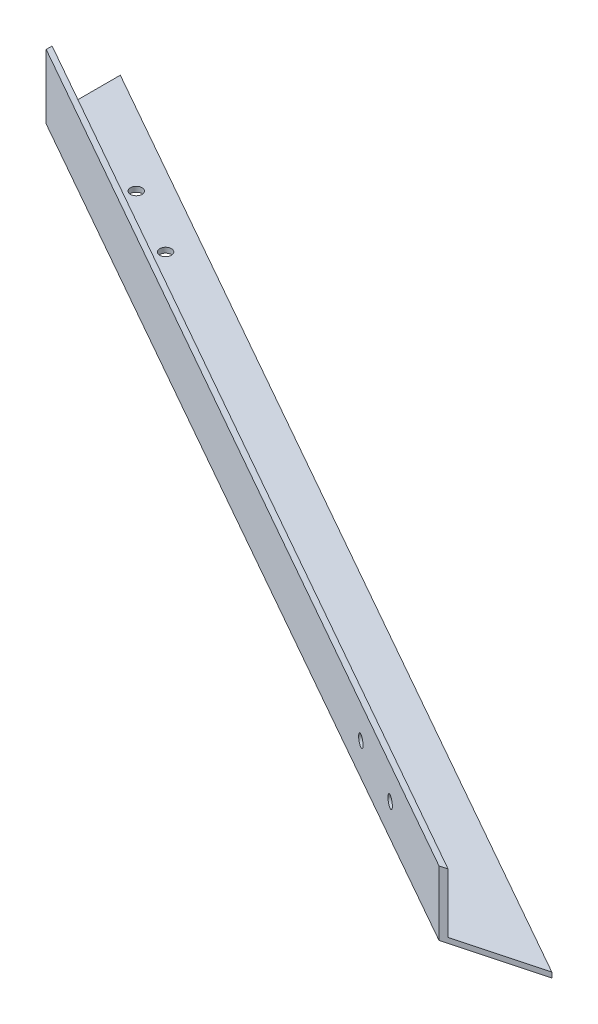
ISO-10303-21;
HEADER;
FILE_DESCRIPTION(('STEP AP214'),'2;1');
FILE_NAME('part.step','',(''),(''),'','','');
FILE_SCHEMA(('AUTOMOTIVE_DESIGN { 1 0 10303 214 1 1 1 1 }'));
ENDSEC;
DATA;
#1=APPLICATION_CONTEXT('core data for automotive mechanical design processes');
#2=APPLICATION_PROTOCOL_DEFINITION('international standard','automotive_design',2000,#1);
#3=PRODUCT_CONTEXT('',#1,'mechanical');
#4=PRODUCT('Part','Part','',(#3));
#5=PRODUCT_RELATED_PRODUCT_CATEGORY('part','',(#4));
#6=PRODUCT_DEFINITION_FORMATION('','',#4);
#7=PRODUCT_DEFINITION_CONTEXT('part definition',#1,'design');
#8=PRODUCT_DEFINITION('design','',#6,#7);
#9=PRODUCT_DEFINITION_SHAPE('','',#8);
#10=(LENGTH_UNIT() NAMED_UNIT(*) SI_UNIT(.MILLI.,.METRE.));
#11=(NAMED_UNIT(*) PLANE_ANGLE_UNIT() SI_UNIT($,.RADIAN.));
#12=(NAMED_UNIT(*) SI_UNIT($,.STERADIAN.) SOLID_ANGLE_UNIT());
#13=UNCERTAINTY_MEASURE_WITH_UNIT(LENGTH_MEASURE(1.E-05),#10,'distance_accuracy_value','');
#14=(GEOMETRIC_REPRESENTATION_CONTEXT(3) GLOBAL_UNCERTAINTY_ASSIGNED_CONTEXT((#13)) GLOBAL_UNIT_ASSIGNED_CONTEXT((#10,
#11,#12)) REPRESENTATION_CONTEXT('',''));
#15=CARTESIAN_POINT('',(0.,0.,0.));
#16=DIRECTION('',(0.,0.,1.));
#17=DIRECTION('',(1.,0.,0.));
#18=AXIS2_PLACEMENT_3D('',#15,#16,#17);
#19=CARTESIAN_POINT('',(133.91486374625,-20.99,1414.117210859));
#20=DIRECTION('',(0.,1.,0.));
#21=DIRECTION('',(0.87056898008277,0.,0.49204639102187));
#22=AXIS2_PLACEMENT_3D('',#19,#20,#21);
#23=CYLINDRICAL_SURFACE('',#22,4.5);
#24=CARTESIAN_POINT('',(133.91486374625,-21.,1414.117210859));
#25=DIRECTION('',(0.,1.,0.));
#26=DIRECTION('',(0.870568980082769,0.,0.49204639102187));
#27=AXIS2_PLACEMENT_3D('',#24,#25,#26);
#28=CIRCLE('',#27,4.5);
#29=CARTESIAN_POINT('',(137.83242415662,-21.,1416.331419619));
#30=VERTEX_POINT('',#29);
#31=EDGE_CURVE('E231',#30,#30,#28,.T.);
#32=ORIENTED_EDGE('',*,*,#31,.T.);
#33=DIRECTION('',(0.,-1.,0.));
#34=VECTOR('',#33,1.);
#35=CARTESIAN_POINT('',(137.83242415662,-20.99,1416.331419619));
#36=LINE('',#35,#34);
#37=CARTESIAN_POINT('',(137.83242415662,-25.,1416.331419619));
#38=VERTEX_POINT('',#37);
#39=EDGE_CURVE('E11',#30,#38,#36,.T.);
#40=ORIENTED_EDGE('',*,*,#39,.T.);
#41=CARTESIAN_POINT('',(133.91486374625,-25.,1414.117210859));
#42=DIRECTION('',(0.,1.,0.));
#43=DIRECTION('',(0.870568980082769,0.,0.49204639102187));
#44=AXIS2_PLACEMENT_3D('',#41,#42,#43);
#45=CIRCLE('',#44,4.5);
#46=EDGE_CURVE('E175',#38,#38,#45,.T.);
#47=ORIENTED_EDGE('',*,*,#46,.F.);
#48=ORIENTED_EDGE('',*,*,#39,.F.);
#49=EDGE_LOOP('',(#32,#40,#47,#48));
#50=FACE_BOUND('',#49,.T.);
#51=ADVANCED_FACE('F17',(#50),#23,.F.);
#52=CARTESIAN_POINT('',(186.14900255121,-20.99,1443.639994321));
#53=DIRECTION('',(0.,1.,0.));
#54=DIRECTION('',(0.87056898008277,0.,0.49204639102187));
#55=AXIS2_PLACEMENT_3D('',#52,#53,#54);
#56=CYLINDRICAL_SURFACE('',#55,4.5);
#57=CARTESIAN_POINT('',(186.14900255121,-21.,1443.639994321));
#58=DIRECTION('',(0.,1.,0.));
#59=DIRECTION('',(0.870568980082769,0.,0.49204639102187));
#60=AXIS2_PLACEMENT_3D('',#57,#58,#59);
#61=CIRCLE('',#60,4.5);
#62=CARTESIAN_POINT('',(190.06656296158,-21.,1445.85420308));
#63=VERTEX_POINT('',#62);
#64=EDGE_CURVE('E228',#63,#63,#61,.T.);
#65=ORIENTED_EDGE('',*,*,#64,.T.);
#66=DIRECTION('',(0.,-1.,0.));
#67=VECTOR('',#66,1.);
#68=CARTESIAN_POINT('',(190.06656296158,-20.99,1445.85420308));
#69=LINE('',#68,#67);
#70=CARTESIAN_POINT('',(190.06656296158,-25.,1445.85420308));
#71=VERTEX_POINT('',#70);
#72=EDGE_CURVE('E25',#63,#71,#69,.T.);
#73=ORIENTED_EDGE('',*,*,#72,.T.);
#74=CARTESIAN_POINT('',(186.14900255121,-25.,1443.639994321));
#75=DIRECTION('',(0.,1.,0.));
#76=DIRECTION('',(0.870568980082769,0.,0.49204639102187));
#77=AXIS2_PLACEMENT_3D('',#74,#75,#76);
#78=CIRCLE('',#77,4.5);
#79=EDGE_CURVE('E136',#71,#71,#78,.T.);
#80=ORIENTED_EDGE('',*,*,#79,.F.);
#81=ORIENTED_EDGE('',*,*,#72,.F.);
#82=EDGE_LOOP('',(#65,#73,#80,#81));
#83=FACE_BOUND('',#82,.T.);
#84=ADVANCED_FACE('F235',(#83),#56,.F.);
#85=CARTESIAN_POINT('',(-60.49586299341,25.,1332.952940038));
#86=DIRECTION('',(0.49204639102187,0.,-0.870568980082769));
#87=DIRECTION('',(0.,-1.,0.));
#88=AXIS2_PLACEMENT_3D('',#85,#86,#87);
#89=PLANE('',#88);
#90=CARTESIAN_POINT('',(612.67714875088,0.,1713.430947571));
#91=DIRECTION('',(0.49204639102187,0.,-0.870568980082769));
#92=DIRECTION('',(0.870568980082769,0.,0.49204639102187));
#93=AXIS2_PLACEMENT_3D('',#90,#91,#92);
#94=CIRCLE('',#93,4.5);
#95=CARTESIAN_POINT('',(616.59470916125,0.,1715.645156331));
#96=VERTEX_POINT('',#95);
#97=EDGE_CURVE('E217',#96,#96,#94,.T.);
#98=ORIENTED_EDGE('',*,*,#97,.F.);
#99=EDGE_LOOP('',(#98));
#100=FACE_BOUND('',#99,.T.);
#101=CARTESIAN_POINT('',(664.91128755585,0.,1742.953731033));
#102=DIRECTION('',(0.49204639102187,0.,-0.870568980082769));
#103=DIRECTION('',(0.870568980082769,0.,0.49204639102187));
#104=AXIS2_PLACEMENT_3D('',#101,#102,#103);
#105=CIRCLE('',#104,4.5);
#106=CARTESIAN_POINT('',(668.82884796622,0.,1745.167939792));
#107=VERTEX_POINT('',#106);
#108=EDGE_CURVE('E183',#107,#107,#105,.T.);
#109=ORIENTED_EDGE('',*,*,#108,.F.);
#110=EDGE_LOOP('',(#109));
#111=FACE_BOUND('',#110,.T.);
#112=DIRECTION('',(0.,-1.,0.));
#113=VECTOR('',#112,1.);
#114=CARTESIAN_POINT('',(50.,12.5,1395.405303782));
#115=LINE('',#114,#113);
#116=CARTESIAN_POINT('',(50.,25.,1395.405303782));
#117=VERTEX_POINT('',#116);
#118=CARTESIAN_POINT('',(50.,-21.,1395.405303782));
#119=VERTEX_POINT('',#118);
#120=EDGE_CURVE('E189',#117,#119,#115,.T.);
#121=ORIENTED_EDGE('',*,*,#120,.F.);
#122=DIRECTION('',(0.870568980082769,0.,0.49204639102187));
#123=VECTOR('',#122,1.);
#124=CARTESIAN_POINT('',(-60.49586299341,25.,1332.952940038));
#125=LINE('',#124,#123);
#126=CARTESIAN_POINT('',(755.51484796426,25.,1794.162946997));
#127=VERTEX_POINT('',#126);
#128=EDGE_CURVE('E205',#117,#127,#125,.T.);
#129=ORIENTED_EDGE('',*,*,#128,.T.);
#130=DIRECTION('',(0.,1.,0.));
#131=VECTOR('',#130,1.);
#132=CARTESIAN_POINT('',(755.51484796427,12.5,1794.162946997));
#133=LINE('',#132,#131);
#134=CARTESIAN_POINT('',(755.51484796426,-21.,1794.162946997));
#135=VERTEX_POINT('',#134);
#136=EDGE_CURVE('E188',#135,#127,#133,.T.);
#137=ORIENTED_EDGE('',*,*,#136,.F.);
#138=DIRECTION('',(0.870568980082769,0.,0.49204639102187));
#139=VECTOR('',#138,1.);
#140=CARTESIAN_POINT('',(-60.49586299341,-21.,1332.952940038));
#141=LINE('',#140,#139);
#142=EDGE_CURVE('E86',#119,#135,#141,.T.);
#143=ORIENTED_EDGE('',*,*,#142,.F.);
#144=EDGE_LOOP('',(#121,#129,#137,#143));
#145=FACE_BOUND('',#144,.T.);
#146=ADVANCED_FACE('F259',(#100,#111,#145),#89,.T.);
#147=CARTESIAN_POINT('',(-60.49586299341,-21.,1332.952940038));
#148=DIRECTION('',(0.,1.,0.));
#149=DIRECTION('',(1.,0.,0.));
#150=AXIS2_PLACEMENT_3D('',#147,#148,#149);
#151=PLANE('',#150);
#152=ORIENTED_EDGE('',*,*,#31,.F.);
#153=EDGE_LOOP('',(#152));
#154=FACE_BOUND('',#153,.T.);
#155=ORIENTED_EDGE('',*,*,#64,.F.);
#156=EDGE_LOOP('',(#155));
#157=FACE_BOUND('',#156,.T.);
#158=DIRECTION('',(0.,0.,-1.));
#159=VECTOR('',#158,1.);
#160=CARTESIAN_POINT('',(50.,-21.,1366.476470019));
#161=LINE('',#160,#159);
#162=CARTESIAN_POINT('',(50.,-21.,1342.566297279));
#163=VERTEX_POINT('',#162);
#164=EDGE_CURVE('E193',#119,#163,#161,.T.);
#165=ORIENTED_EDGE('',*,*,#164,.F.);
#166=ORIENTED_EDGE('',*,*,#142,.T.);
#167=DIRECTION('',(-0.965925826288944,0.,0.258819045102985));
#168=VECTOR('',#167,1.);
#169=CARTESIAN_POINT('',(50.852210073641,-21.,1982.976731756));
#170=LINE('',#169,#168);
#171=CARTESIAN_POINT('',(818.93559955336,-21.,1777.169407825));
#172=VERTEX_POINT('',#171);
#173=EDGE_CURVE('E159',#172,#135,#170,.T.);
#174=ORIENTED_EDGE('',*,*,#173,.F.);
#175=DIRECTION('',(0.870568980082769,0.,0.49204639102187));
#176=VECTOR('',#175,1.);
#177=CARTESIAN_POINT('',(-37.86172900639,-21.,1292.906766954));
#178=LINE('',#177,#176);
#179=EDGE_CURVE('E99',#163,#172,#178,.T.);
#180=ORIENTED_EDGE('',*,*,#179,.F.);
#181=EDGE_LOOP('',(#165,#166,#174,#180));
#182=FACE_BOUND('',#181,.T.);
#183=ADVANCED_FACE('F262',(#154,#157,#182),#151,.T.);
#184=CARTESIAN_POINT('',(-37.86172900639,-21.,1292.906766954));
#185=DIRECTION('',(0.49204639102187,0.,-0.870568980082769));
#186=DIRECTION('',(0.,-1.,0.));
#187=AXIS2_PLACEMENT_3D('',#184,#185,#186);
#188=PLANE('',#187);
#189=DIRECTION('',(0.,-1.,0.));
#190=VECTOR('',#189,1.);
#191=CARTESIAN_POINT('',(50.,-10.5,1342.566297279));
#192=LINE('',#191,#190);
#193=CARTESIAN_POINT('',(50.,-25.,1342.566297279));
#194=VERTEX_POINT('',#193);
#195=EDGE_CURVE('E165',#163,#194,#192,.T.);
#196=ORIENTED_EDGE('',*,*,#195,.F.);
#197=ORIENTED_EDGE('',*,*,#179,.T.);
#198=DIRECTION('',(0.,1.,0.));
#199=VECTOR('',#198,1.);
#200=CARTESIAN_POINT('',(818.93559955336,-10.5,1777.169407825));
#201=LINE('',#200,#199);
#202=CARTESIAN_POINT('',(818.93559955336,-25.,1777.169407825));
#203=VERTEX_POINT('',#202);
#204=EDGE_CURVE('E209',#203,#172,#201,.T.);
#205=ORIENTED_EDGE('',*,*,#204,.F.);
#206=DIRECTION('',(0.870568980082769,0.,0.49204639102187));
#207=VECTOR('',#206,1.);
#208=CARTESIAN_POINT('',(-37.86172900639,-25.,1292.906766954));
#209=LINE('',#208,#207);
#210=EDGE_CURVE('E132',#194,#203,#209,.T.);
#211=ORIENTED_EDGE('',*,*,#210,.F.);
#212=EDGE_LOOP('',(#196,#197,#205,#211));
#213=FACE_BOUND('',#212,.T.);
#214=ADVANCED_FACE('F265',(#213),#188,.T.);
#215=CARTESIAN_POINT('',(612.68206921477,0.,1713.422241881));
#216=DIRECTION('',(0.49204639102187,0.,-0.870568980082769));
#217=DIRECTION('',(0.87056898008277,0.,0.49204639102187));
#218=AXIS2_PLACEMENT_3D('',#215,#216,#217);
#219=CYLINDRICAL_SURFACE('',#218,4.5);
#220=ORIENTED_EDGE('',*,*,#97,.T.);
#221=DIRECTION('',(-0.49204639102187,0.,0.870568980082769));
#222=VECTOR('',#221,1.);
#223=CARTESIAN_POINT('',(616.59962962514,0.,1715.636450641));
#224=LINE('',#223,#222);
#225=CARTESIAN_POINT('',(614.62652359731,0.,1719.127432251));
#226=VERTEX_POINT('',#225);
#227=EDGE_CURVE('E221',#96,#226,#224,.T.);
#228=ORIENTED_EDGE('',*,*,#227,.T.);
#229=CARTESIAN_POINT('',(610.70896318693,0.,1716.913223491));
#230=DIRECTION('',(0.49204639102187,0.,-0.870568980082769));
#231=DIRECTION('',(0.870568980082769,0.,0.49204639102187));
#232=AXIS2_PLACEMENT_3D('',#229,#230,#231);
#233=CIRCLE('',#232,4.5);
#234=EDGE_CURVE('E174',#226,#226,#233,.T.);
#235=ORIENTED_EDGE('',*,*,#234,.F.);
#236=ORIENTED_EDGE('',*,*,#227,.F.);
#237=EDGE_LOOP('',(#220,#228,#235,#236));
#238=FACE_BOUND('',#237,.T.);
#239=ADVANCED_FACE('F295',(#238),#219,.F.);
#240=CARTESIAN_POINT('',(664.91620801973,0.,1742.945025343));
#241=DIRECTION('',(0.49204639102187,0.,-0.870568980082769));
#242=DIRECTION('',(0.87056898008277,0.,0.49204639102187));
#243=AXIS2_PLACEMENT_3D('',#240,#241,#242);
#244=CYLINDRICAL_SURFACE('',#243,4.5);
#245=ORIENTED_EDGE('',*,*,#108,.T.);
#246=DIRECTION('',(-0.49204639102187,0.,0.870568980082769));
#247=VECTOR('',#246,1.);
#248=CARTESIAN_POINT('',(668.8337684301,0.,1745.159234102));
#249=LINE('',#248,#247);
#250=CARTESIAN_POINT('',(666.86066240227,0.,1748.650215712));
#251=VERTEX_POINT('',#250);
#252=EDGE_CURVE('E187',#107,#251,#249,.T.);
#253=ORIENTED_EDGE('',*,*,#252,.T.);
#254=CARTESIAN_POINT('',(662.9431019919,0.,1746.436006953));
#255=DIRECTION('',(0.49204639102187,0.,-0.870568980082769));
#256=DIRECTION('',(0.870568980082769,0.,0.49204639102187));
#257=AXIS2_PLACEMENT_3D('',#254,#255,#256);
#258=CIRCLE('',#257,4.5);
#259=EDGE_CURVE('E168',#251,#251,#258,.T.);
#260=ORIENTED_EDGE('',*,*,#259,.F.);
#261=ORIENTED_EDGE('',*,*,#252,.F.);
#262=EDGE_LOOP('',(#245,#253,#260,#261));
#263=FACE_BOUND('',#262,.T.);
#264=ADVANCED_FACE('F300',(#263),#244,.F.);
#265=CARTESIAN_POINT('',(-7.764571353077,0.,1998.683051002));
#266=DIRECTION('',(-0.258819045102985,0.,-0.965925826288944));
#267=DIRECTION('',(-0.965925826288944,0.,0.258819045102985));
#268=AXIS2_PLACEMENT_3D('',#265,#266,#267);
#269=PLANE('',#268);
#270=DIRECTION('',(0.965925826288944,0.,-0.258819045102985));
#271=VECTOR('',#270,1.);
#272=CARTESIAN_POINT('',(66.416948962224,-25.,1978.80617254));
#273=LINE('',#272,#271);
#274=CARTESIAN_POINT('',(750.,-25.,1795.640646055));
#275=VERTEX_POINT('',#274);
#276=EDGE_CURVE('E125',#275,#203,#273,.T.);
#277=ORIENTED_EDGE('',*,*,#276,.T.);
#278=ORIENTED_EDGE('',*,*,#204,.T.);
#279=ORIENTED_EDGE('',*,*,#173,.T.);
#280=ORIENTED_EDGE('',*,*,#136,.T.);
#281=DIRECTION('',(-0.965925826288944,0.,0.258819045102985));
#282=VECTOR('',#281,1.);
#283=CARTESIAN_POINT('',(49.498754518112,25.,1983.339389079));
#284=LINE('',#283,#282);
#285=CARTESIAN_POINT('',(750.,25.,1795.640646055));
#286=VERTEX_POINT('',#285);
#287=EDGE_CURVE('E142',#127,#286,#284,.T.);
#288=ORIENTED_EDGE('',*,*,#287,.T.);
#289=DIRECTION('',(0.,-1.,0.));
#290=VECTOR('',#289,1.);
#291=CARTESIAN_POINT('',(750.,-12.5,1795.640646055));
#292=LINE('',#291,#290);
#293=EDGE_CURVE('E139',#286,#275,#292,.T.);
#294=ORIENTED_EDGE('',*,*,#293,.T.);
#295=EDGE_LOOP('',(#277,#278,#279,#280,#288,#294));
#296=FACE_BOUND('',#295,.T.);
#297=ADVANCED_FACE('F140',(#296),#269,.F.);
#298=CARTESIAN_POINT('',(-62.4640485575,25.,1336.435215958));
#299=DIRECTION('',(0.,1.,0.));
#300=DIRECTION('',(1.,0.,0.));
#301=AXIS2_PLACEMENT_3D('',#298,#299,#300);
#302=PLANE('',#301);
#303=DIRECTION('',(0.,0.,-1.));
#304=VECTOR('',#303,1.);
#305=CARTESIAN_POINT('',(50.,25.,1368.217607979));
#306=LINE('',#305,#304);
#307=CARTESIAN_POINT('',(50.,25.,1400.));
#308=VERTEX_POINT('',#307);
#309=EDGE_CURVE('E182',#308,#117,#306,.T.);
#310=ORIENTED_EDGE('',*,*,#309,.F.);
#311=DIRECTION('',(0.870568980082769,0.,0.49204639102187));
#312=VECTOR('',#311,1.);
#313=CARTESIAN_POINT('',(-62.4640485575,25.,1336.435215958));
#314=LINE('',#313,#312);
#315=EDGE_CURVE('E147',#308,#286,#314,.T.);
#316=ORIENTED_EDGE('',*,*,#315,.T.);
#317=ORIENTED_EDGE('',*,*,#287,.F.);
#318=ORIENTED_EDGE('',*,*,#128,.F.);
#319=EDGE_LOOP('',(#310,#316,#317,#318));
#320=FACE_BOUND('',#319,.T.);
#321=ADVANCED_FACE('F240',(#320),#302,.T.);
#322=CARTESIAN_POINT('',(-37.86172900639,-25.,1292.906766954));
#323=DIRECTION('',(0.,-1.,0.));
#324=DIRECTION('',(0.,0.,-1.));
#325=AXIS2_PLACEMENT_3D('',#322,#323,#324);
#326=PLANE('',#325);
#327=ORIENTED_EDGE('',*,*,#46,.T.);
#328=EDGE_LOOP('',(#327));
#329=FACE_BOUND('',#328,.T.);
#330=ORIENTED_EDGE('',*,*,#79,.T.);
#331=EDGE_LOOP('',(#330));
#332=FACE_BOUND('',#331,.T.);
#333=DIRECTION('',(0.,0.,1.));
#334=VECTOR('',#333,1.);
#335=CARTESIAN_POINT('',(50.,-25.,1346.453383477));
#336=LINE('',#335,#334);
#337=CARTESIAN_POINT('',(50.,-25.,1400.));
#338=VERTEX_POINT('',#337);
#339=EDGE_CURVE('E161',#194,#338,#336,.T.);
#340=ORIENTED_EDGE('',*,*,#339,.F.);
#341=ORIENTED_EDGE('',*,*,#210,.T.);
#342=ORIENTED_EDGE('',*,*,#276,.F.);
#343=DIRECTION('',(0.870568980082769,0.,0.49204639102187));
#344=VECTOR('',#343,1.);
#345=CARTESIAN_POINT('',(-62.4640485575,-25.,1336.435215958));
#346=LINE('',#345,#344);
#347=EDGE_CURVE('E130',#338,#275,#346,.T.);
#348=ORIENTED_EDGE('',*,*,#347,.F.);
#349=EDGE_LOOP('',(#340,#341,#342,#348));
#350=FACE_BOUND('',#349,.T.);
#351=ADVANCED_FACE('F128',(#329,#332,#350),#326,.T.);
#352=CARTESIAN_POINT('',(50.,0.,1400.));
#353=DIRECTION('',(1.,0.,0.));
#354=DIRECTION('',(0.,1.,0.));
#355=AXIS2_PLACEMENT_3D('',#352,#353,#354);
#356=PLANE('',#355);
#357=ORIENTED_EDGE('',*,*,#309,.T.);
#358=ORIENTED_EDGE('',*,*,#120,.T.);
#359=ORIENTED_EDGE('',*,*,#164,.T.);
#360=ORIENTED_EDGE('',*,*,#195,.T.);
#361=ORIENTED_EDGE('',*,*,#339,.T.);
#362=DIRECTION('',(0.,1.,0.));
#363=VECTOR('',#362,1.);
#364=CARTESIAN_POINT('',(50.,-12.5,1400.));
#365=LINE('',#364,#363);
#366=EDGE_CURVE('E151',#338,#308,#365,.T.);
#367=ORIENTED_EDGE('',*,*,#366,.T.);
#368=EDGE_LOOP('',(#357,#358,#359,#360,#361,#367));
#369=FACE_BOUND('',#368,.T.);
#370=ADVANCED_FACE('F239',(#369),#356,.F.);
#371=CARTESIAN_POINT('',(-62.4640485575,-25.,1336.435215958));
#372=DIRECTION('',(-0.49204639102187,0.,0.870568980082769));
#373=DIRECTION('',(0.,1.,0.));
#374=AXIS2_PLACEMENT_3D('',#371,#372,#373);
#375=PLANE('',#374);
#376=ORIENTED_EDGE('',*,*,#234,.T.);
#377=EDGE_LOOP('',(#376));
#378=FACE_BOUND('',#377,.T.);
#379=ORIENTED_EDGE('',*,*,#259,.T.);
#380=EDGE_LOOP('',(#379));
#381=FACE_BOUND('',#380,.T.);
#382=ORIENTED_EDGE('',*,*,#366,.F.);
#383=ORIENTED_EDGE('',*,*,#347,.T.);
#384=ORIENTED_EDGE('',*,*,#293,.F.);
#385=ORIENTED_EDGE('',*,*,#315,.F.);
#386=EDGE_LOOP('',(#382,#383,#384,#385));
#387=FACE_BOUND('',#386,.T.);
#388=ADVANCED_FACE('F149',(#378,#381,#387),#375,.T.);
#389=CLOSED_SHELL('',(#51,#84,#146,#183,#214,#239,#264,#297,#321,#351,#370,#388));
#390=MANIFOLD_SOLID_BREP('B1',#389);
#391=ADVANCED_BREP_SHAPE_REPRESENTATION('',(#18,#390),#14);
#392=SHAPE_DEFINITION_REPRESENTATION(#9,#391);
ENDSEC;
END-ISO-10303-21;
